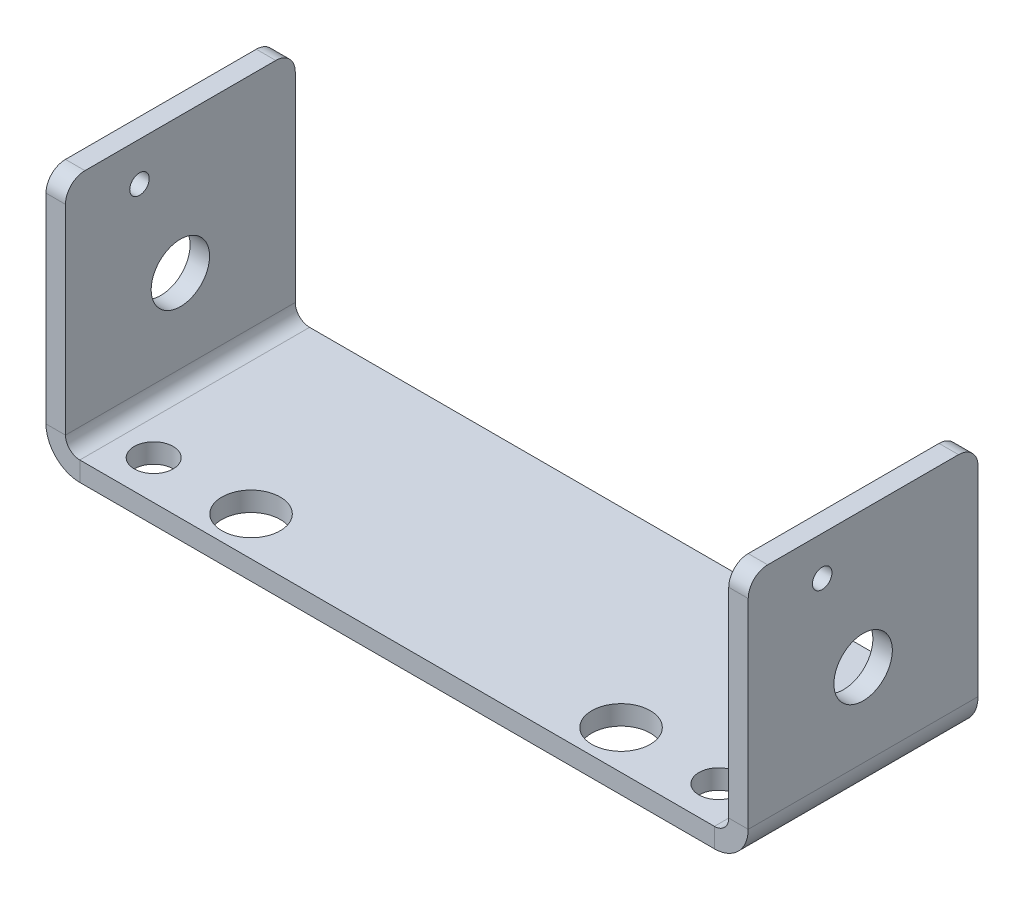
ISO-10303-21;
HEADER;
FILE_DESCRIPTION(('STEP AP214'),'2;1');
FILE_NAME('part.step','',(''),(''),'','','');
FILE_SCHEMA(('AUTOMOTIVE_DESIGN { 1 0 10303 214 1 1 1 1 }'));
ENDSEC;
DATA;
#1=APPLICATION_CONTEXT('core data for automotive mechanical design processes');
#2=APPLICATION_PROTOCOL_DEFINITION('international standard','automotive_design',2000,#1);
#3=PRODUCT_CONTEXT('',#1,'mechanical');
#4=PRODUCT('Part','Part','',(#3));
#5=PRODUCT_RELATED_PRODUCT_CATEGORY('part','',(#4));
#6=PRODUCT_DEFINITION_FORMATION('','',#4);
#7=PRODUCT_DEFINITION_CONTEXT('part definition',#1,'design');
#8=PRODUCT_DEFINITION('design','',#6,#7);
#9=PRODUCT_DEFINITION_SHAPE('','',#8);
#10=(LENGTH_UNIT() NAMED_UNIT(*) SI_UNIT(.MILLI.,.METRE.));
#11=(NAMED_UNIT(*) PLANE_ANGLE_UNIT() SI_UNIT($,.RADIAN.));
#12=(NAMED_UNIT(*) SI_UNIT($,.STERADIAN.) SOLID_ANGLE_UNIT());
#13=UNCERTAINTY_MEASURE_WITH_UNIT(LENGTH_MEASURE(1.E-05),#10,'distance_accuracy_value','');
#14=(GEOMETRIC_REPRESENTATION_CONTEXT(3) GLOBAL_UNCERTAINTY_ASSIGNED_CONTEXT((#13)) GLOBAL_UNIT_ASSIGNED_CONTEXT((#10,
#11,#12)) REPRESENTATION_CONTEXT('',''));
#15=CARTESIAN_POINT('',(0.,0.,0.));
#16=DIRECTION('',(0.,0.,1.));
#17=DIRECTION('',(1.,0.,0.));
#18=AXIS2_PLACEMENT_3D('',#15,#16,#17);
#19=CARTESIAN_POINT('',(-63.0307532622855,33.5307532622854,5.89999999999999));
#20=DIRECTION('',(0.,0.,1.));
#21=DIRECTION('',(1.,0.,0.));
#22=AXIS2_PLACEMENT_3D('',#19,#20,#21);
#23=PLANE('',#22);
#24=DIRECTION('',(1.,0.,0.));
#25=VECTOR('',#24,1.);
#26=CARTESIAN_POINT('',(-63.0307532622855,33.5307532622854,5.89999999999999));
#27=LINE('',#26,#25);
#28=CARTESIAN_POINT('',(-50.824906524571,33.5307532622854,5.89999999999999));
#29=VERTEX_POINT('',#28);
#30=CARTESIAN_POINT('',(-18.2366000000001,33.5307532622854,5.89999999999999));
#31=VERTEX_POINT('',#30);
#32=EDGE_CURVE('E175',#29,#31,#27,.T.);
#33=ORIENTED_EDGE('',*,*,#32,.T.);
#34=DIRECTION('',(0.,1.,0.));
#35=VECTOR('',#34,1.);
#36=CARTESIAN_POINT('',(-18.2366000000001,33.5307532622854,5.89999999999999));
#37=LINE('',#36,#35);
#38=CARTESIAN_POINT('',(-18.2366000000001,34.5307532622854,5.89999999999999));
#39=VERTEX_POINT('',#38);
#40=EDGE_CURVE('E12',#31,#39,#37,.T.);
#41=ORIENTED_EDGE('',*,*,#40,.T.);
#42=DIRECTION('',(1.,0.,0.));
#43=VECTOR('',#42,1.);
#44=CARTESIAN_POINT('',(-63.0307532622855,34.5307532622854,5.89999999999999));
#45=LINE('',#44,#43);
#46=CARTESIAN_POINT('',(-50.824906524571,34.5307532622854,5.89999999999999));
#47=VERTEX_POINT('',#46);
#48=EDGE_CURVE('E61',#47,#39,#45,.T.);
#49=ORIENTED_EDGE('',*,*,#48,.F.);
#50=DIRECTION('',(0.,-1.,0.));
#51=VECTOR('',#50,1.);
#52=CARTESIAN_POINT('',(-50.824906524571,33.5307532622854,5.89999999999999));
#53=LINE('',#52,#51);
#54=EDGE_CURVE('E351',#47,#29,#53,.T.);
#55=ORIENTED_EDGE('',*,*,#54,.T.);
#56=EDGE_LOOP('',(#33,#41,#49,#55));
#57=FACE_BOUND('',#56,.T.);
#58=ADVANCED_FACE('F45',(#57),#23,.T.);
#59=CARTESIAN_POINT('',(-63.0307532622855,33.5307532622854,-5.90000000000001));
#60=DIRECTION('',(0.,0.,-1.));
#61=DIRECTION('',(-1.,0.,0.));
#62=AXIS2_PLACEMENT_3D('',#59,#60,#61);
#63=PLANE('',#62);
#64=DIRECTION('',(-1.,0.,0.));
#65=VECTOR('',#64,1.);
#66=CARTESIAN_POINT('',(-63.0307532622855,34.5307532622854,-5.90000000000001));
#67=LINE('',#66,#65);
#68=CARTESIAN_POINT('',(-18.2366000000001,34.5307532622854,-5.90000000000001));
#69=VERTEX_POINT('',#68);
#70=CARTESIAN_POINT('',(-50.824906524571,34.5307532622854,-5.90000000000001));
#71=VERTEX_POINT('',#70);
#72=EDGE_CURVE('E68',#69,#71,#67,.T.);
#73=ORIENTED_EDGE('',*,*,#72,.F.);
#74=DIRECTION('',(0.,-1.,0.));
#75=VECTOR('',#74,1.);
#76=CARTESIAN_POINT('',(-18.2366000000001,33.5307532622854,-5.90000000000001));
#77=LINE('',#76,#75);
#78=CARTESIAN_POINT('',(-18.2366000000001,33.5307532622854,-5.90000000000001));
#79=VERTEX_POINT('',#78);
#80=EDGE_CURVE('E156',#69,#79,#77,.T.);
#81=ORIENTED_EDGE('',*,*,#80,.T.);
#82=DIRECTION('',(-1.,0.,0.));
#83=VECTOR('',#82,1.);
#84=CARTESIAN_POINT('',(-63.0307532622855,33.5307532622854,-5.90000000000001));
#85=LINE('',#84,#83);
#86=CARTESIAN_POINT('',(-50.824906524571,33.5307532622854,-5.90000000000001));
#87=VERTEX_POINT('',#86);
#88=EDGE_CURVE('E48',#79,#87,#85,.T.);
#89=ORIENTED_EDGE('',*,*,#88,.T.);
#90=DIRECTION('',(0.,1.,0.));
#91=VECTOR('',#90,1.);
#92=CARTESIAN_POINT('',(-50.824906524571,33.5307532622854,-5.90000000000001));
#93=LINE('',#92,#91);
#94=EDGE_CURVE('E184',#87,#71,#93,.T.);
#95=ORIENTED_EDGE('',*,*,#94,.T.);
#96=EDGE_LOOP('',(#73,#81,#89,#95));
#97=FACE_BOUND('',#96,.T.);
#98=ADVANCED_FACE('F158',(#97),#63,.T.);
#99=CARTESIAN_POINT('',(-6.03075326228553,34.5307532622854,4.89999999999999));
#100=DIRECTION('',(0.,1.,0.));
#101=DIRECTION('',(0.,0.,1.));
#102=AXIS2_PLACEMENT_3D('',#99,#100,#101);
#103=PLANE('',#102);
#104=CARTESIAN_POINT('',(-49.0307532622855,34.5307532622854,3.89999999999999));
#105=DIRECTION('',(0.,1.,0.));
#106=DIRECTION('',(0.,0.,1.));
#107=AXIS2_PLACEMENT_3D('',#104,#105,#106);
#108=CIRCLE('',#107,1.);
#109=CARTESIAN_POINT('',(-49.0307532622855,34.5307532622854,4.89999999999999));
#110=VERTEX_POINT('',#109);
#111=EDGE_CURVE('E271',#110,#110,#108,.T.);
#112=ORIENTED_EDGE('',*,*,#111,.F.);
#113=EDGE_LOOP('',(#112));
#114=FACE_BOUND('',#113,.T.);
#115=CARTESIAN_POINT('',(-44.0307532622855,34.5307532622854,3.89999999999999));
#116=DIRECTION('',(0.,1.,0.));
#117=DIRECTION('',(0.,0.,1.));
#118=AXIS2_PLACEMENT_3D('',#115,#116,#117);
#119=CIRCLE('',#118,1.5);
#120=CARTESIAN_POINT('',(-44.0307532622855,34.5307532622854,5.39999999999999));
#121=VERTEX_POINT('',#120);
#122=EDGE_CURVE('E330',#121,#121,#119,.T.);
#123=ORIENTED_EDGE('',*,*,#122,.F.);
#124=EDGE_LOOP('',(#123));
#125=FACE_BOUND('',#124,.T.);
#126=CARTESIAN_POINT('',(-20.0307532622855,34.5307532622854,3.89999999999999));
#127=DIRECTION('',(0.,1.,0.));
#128=DIRECTION('',(0.,0.,1.));
#129=AXIS2_PLACEMENT_3D('',#126,#127,#128);
#130=CIRCLE('',#129,1.);
#131=CARTESIAN_POINT('',(-20.0307532622855,34.5307532622854,4.89999999999999));
#132=VERTEX_POINT('',#131);
#133=EDGE_CURVE('E336',#132,#132,#130,.T.);
#134=ORIENTED_EDGE('',*,*,#133,.F.);
#135=EDGE_LOOP('',(#134));
#136=FACE_BOUND('',#135,.T.);
#137=CARTESIAN_POINT('',(-25.0307532622855,34.5307532622854,3.89999999999999));
#138=DIRECTION('',(0.,1.,0.));
#139=DIRECTION('',(0.,0.,1.));
#140=AXIS2_PLACEMENT_3D('',#137,#138,#139);
#141=CIRCLE('',#140,1.5);
#142=CARTESIAN_POINT('',(-25.0307532622855,34.5307532622854,5.39999999999999));
#143=VERTEX_POINT('',#142);
#144=EDGE_CURVE('E342',#143,#143,#141,.T.);
#145=ORIENTED_EDGE('',*,*,#144,.F.);
#146=EDGE_LOOP('',(#145));
#147=FACE_BOUND('',#146,.T.);
#148=ORIENTED_EDGE('',*,*,#48,.T.);
#149=DIRECTION('',(0.,0.,-1.));
#150=VECTOR('',#149,1.);
#151=CARTESIAN_POINT('',(-18.2366000000001,34.5307532622854,4.89999999999999));
#152=LINE('',#151,#150);
#153=EDGE_CURVE('E53',#39,#69,#152,.T.);
#154=ORIENTED_EDGE('',*,*,#153,.T.);
#155=ORIENTED_EDGE('',*,*,#72,.T.);
#156=DIRECTION('',(0.,0.,1.));
#157=VECTOR('',#156,1.);
#158=CARTESIAN_POINT('',(-50.824906524571,34.5307532622854,4.89999999999998));
#159=LINE('',#158,#157);
#160=EDGE_CURVE('E353',#71,#47,#159,.T.);
#161=ORIENTED_EDGE('',*,*,#160,.T.);
#162=EDGE_LOOP('',(#148,#154,#155,#161));
#163=FACE_BOUND('',#162,.T.);
#164=ADVANCED_FACE('F358',(#114,#125,#136,#147,#163),#103,.T.);
#165=CARTESIAN_POINT('',(-6.03075326228554,33.5307532622854,4.89999999999999));
#166=DIRECTION('',(0.,1.,0.));
#167=DIRECTION('',(0.,0.,1.));
#168=AXIS2_PLACEMENT_3D('',#165,#166,#167);
#169=PLANE('',#168);
#170=DIRECTION('',(0.,0.,-1.));
#171=VECTOR('',#170,1.);
#172=CARTESIAN_POINT('',(-18.2366000000001,33.5307532622854,4.89999999999999));
#173=LINE('',#172,#171);
#174=EDGE_CURVE('E164',#31,#79,#173,.T.);
#175=ORIENTED_EDGE('',*,*,#174,.F.);
#176=ORIENTED_EDGE('',*,*,#32,.F.);
#177=DIRECTION('',(0.,0.,1.));
#178=VECTOR('',#177,1.);
#179=CARTESIAN_POINT('',(-50.824906524571,33.5307532622854,4.89999999999998));
#180=LINE('',#179,#178);
#181=EDGE_CURVE('E173',#87,#29,#180,.T.);
#182=ORIENTED_EDGE('',*,*,#181,.F.);
#183=ORIENTED_EDGE('',*,*,#88,.F.);
#184=EDGE_LOOP('',(#175,#176,#182,#183));
#185=FACE_BOUND('',#184,.T.);
#186=CARTESIAN_POINT('',(-49.0307532622855,33.5307532622854,3.89999999999999));
#187=DIRECTION('',(0.,1.,0.));
#188=DIRECTION('',(0.,0.,1.));
#189=AXIS2_PLACEMENT_3D('',#186,#187,#188);
#190=CIRCLE('',#189,1.);
#191=CARTESIAN_POINT('',(-49.0307532622855,33.5307532622854,4.89999999999999));
#192=VERTEX_POINT('',#191);
#193=EDGE_CURVE('E327',#192,#192,#190,.T.);
#194=ORIENTED_EDGE('',*,*,#193,.T.);
#195=EDGE_LOOP('',(#194));
#196=FACE_BOUND('',#195,.T.);
#197=CARTESIAN_POINT('',(-44.0307532622855,33.5307532622854,3.89999999999999));
#198=DIRECTION('',(0.,1.,0.));
#199=DIRECTION('',(0.,0.,1.));
#200=AXIS2_PLACEMENT_3D('',#197,#198,#199);
#201=CIRCLE('',#200,1.5);
#202=CARTESIAN_POINT('',(-44.0307532622855,33.5307532622854,5.39999999999999));
#203=VERTEX_POINT('',#202);
#204=EDGE_CURVE('E333',#203,#203,#201,.T.);
#205=ORIENTED_EDGE('',*,*,#204,.T.);
#206=EDGE_LOOP('',(#205));
#207=FACE_BOUND('',#206,.T.);
#208=CARTESIAN_POINT('',(-20.0307532622855,33.5307532622854,3.89999999999999));
#209=DIRECTION('',(0.,1.,0.));
#210=DIRECTION('',(0.,0.,1.));
#211=AXIS2_PLACEMENT_3D('',#208,#209,#210);
#212=CIRCLE('',#211,1.);
#213=CARTESIAN_POINT('',(-20.0307532622855,33.5307532622854,4.89999999999999));
#214=VERTEX_POINT('',#213);
#215=EDGE_CURVE('E339',#214,#214,#212,.T.);
#216=ORIENTED_EDGE('',*,*,#215,.T.);
#217=EDGE_LOOP('',(#216));
#218=FACE_BOUND('',#217,.T.);
#219=CARTESIAN_POINT('',(-25.0307532622855,33.5307532622854,3.89999999999999));
#220=DIRECTION('',(0.,1.,0.));
#221=DIRECTION('',(0.,0.,1.));
#222=AXIS2_PLACEMENT_3D('',#219,#220,#221);
#223=CIRCLE('',#222,1.5);
#224=CARTESIAN_POINT('',(-25.0307532622855,33.5307532622854,5.39999999999999));
#225=VERTEX_POINT('',#224);
#226=EDGE_CURVE('E345',#225,#225,#223,.T.);
#227=ORIENTED_EDGE('',*,*,#226,.T.);
#228=EDGE_LOOP('',(#227));
#229=FACE_BOUND('',#228,.T.);
#230=ADVANCED_FACE('F168',(#185,#196,#207,#218,#229),#169,.F.);
#231=CARTESIAN_POINT('',(-25.0307532622855,33.5307532622854,3.89999999999999));
#232=DIRECTION('',(0.,1.,0.));
#233=DIRECTION('',(0.,0.,1.));
#234=AXIS2_PLACEMENT_3D('',#231,#232,#233);
#235=CYLINDRICAL_SURFACE('',#234,1.5);
#236=ORIENTED_EDGE('',*,*,#226,.F.);
#237=EDGE_LOOP('',(#236));
#238=FACE_BOUND('',#237,.T.);
#239=ORIENTED_EDGE('',*,*,#144,.T.);
#240=EDGE_LOOP('',(#239));
#241=FACE_BOUND('',#240,.T.);
#242=ADVANCED_FACE('F427',(#238,#241),#235,.F.);
#243=CARTESIAN_POINT('',(-20.0307532622855,33.5307532622854,3.89999999999999));
#244=DIRECTION('',(0.,1.,0.));
#245=DIRECTION('',(0.,0.,1.));
#246=AXIS2_PLACEMENT_3D('',#243,#244,#245);
#247=CYLINDRICAL_SURFACE('',#246,1.);
#248=ORIENTED_EDGE('',*,*,#215,.F.);
#249=EDGE_LOOP('',(#248));
#250=FACE_BOUND('',#249,.T.);
#251=ORIENTED_EDGE('',*,*,#133,.T.);
#252=EDGE_LOOP('',(#251));
#253=FACE_BOUND('',#252,.T.);
#254=ADVANCED_FACE('F430',(#250,#253),#247,.F.);
#255=CARTESIAN_POINT('',(-44.0307532622855,33.5307532622854,3.89999999999999));
#256=DIRECTION('',(0.,1.,0.));
#257=DIRECTION('',(0.,0.,1.));
#258=AXIS2_PLACEMENT_3D('',#255,#256,#257);
#259=CYLINDRICAL_SURFACE('',#258,1.5);
#260=ORIENTED_EDGE('',*,*,#204,.F.);
#261=EDGE_LOOP('',(#260));
#262=FACE_BOUND('',#261,.T.);
#263=ORIENTED_EDGE('',*,*,#122,.T.);
#264=EDGE_LOOP('',(#263));
#265=FACE_BOUND('',#264,.T.);
#266=ADVANCED_FACE('F434',(#262,#265),#259,.F.);
#267=CARTESIAN_POINT('',(-49.0307532622855,33.5307532622854,3.89999999999999));
#268=DIRECTION('',(0.,1.,0.));
#269=DIRECTION('',(0.,0.,1.));
#270=AXIS2_PLACEMENT_3D('',#267,#268,#269);
#271=CYLINDRICAL_SURFACE('',#270,1.);
#272=ORIENTED_EDGE('',*,*,#193,.F.);
#273=EDGE_LOOP('',(#272));
#274=FACE_BOUND('',#273,.T.);
#275=ORIENTED_EDGE('',*,*,#111,.T.);
#276=EDGE_LOOP('',(#275));
#277=FACE_BOUND('',#276,.T.);
#278=ADVANCED_FACE('F438',(#274,#277),#271,.F.);
#279=CARTESIAN_POINT('',(-52.5615065245709,45.5307532622854,-4.90000000000001));
#280=DIRECTION('',(1.,0.,0.));
#281=DIRECTION('',(0.,0.,1.));
#282=AXIS2_PLACEMENT_3D('',#279,#280,#281);
#283=CYLINDRICAL_SURFACE('',#282,1.);
#284=CARTESIAN_POINT('',(-51.5615065245709,45.5307532622854,-4.90000000000001));
#285=DIRECTION('',(1.,0.,0.));
#286=DIRECTION('',(0.,0.,1.));
#287=AXIS2_PLACEMENT_3D('',#284,#285,#286);
#288=CIRCLE('',#287,1.);
#289=CARTESIAN_POINT('',(-51.5615065245709,45.5307532622854,-5.90000000000001));
#290=VERTEX_POINT('',#289);
#291=CARTESIAN_POINT('',(-51.5615065245709,46.5307532622854,-4.9));
#292=VERTEX_POINT('',#291);
#293=EDGE_CURVE('E282',#290,#292,#288,.T.);
#294=ORIENTED_EDGE('',*,*,#293,.F.);
#295=DIRECTION('',(1.,0.,0.));
#296=VECTOR('',#295,1.);
#297=CARTESIAN_POINT('',(-52.5615065245709,45.5307532622854,-5.90000000000001));
#298=LINE('',#297,#296);
#299=CARTESIAN_POINT('',(-52.5615065245709,45.5307532622854,-5.90000000000001));
#300=VERTEX_POINT('',#299);
#301=EDGE_CURVE('E268',#300,#290,#298,.T.);
#302=ORIENTED_EDGE('',*,*,#301,.F.);
#303=CARTESIAN_POINT('',(-52.5615065245709,45.5307532622854,-4.90000000000001));
#304=DIRECTION('',(1.,0.,0.));
#305=DIRECTION('',(0.,0.,1.));
#306=AXIS2_PLACEMENT_3D('',#303,#304,#305);
#307=CIRCLE('',#306,1.);
#308=CARTESIAN_POINT('',(-52.5615065245709,46.5307532622854,-4.9));
#309=VERTEX_POINT('',#308);
#310=EDGE_CURVE('E316',#300,#309,#307,.T.);
#311=ORIENTED_EDGE('',*,*,#310,.T.);
#312=DIRECTION('',(1.,0.,0.));
#313=VECTOR('',#312,1.);
#314=CARTESIAN_POINT('',(-52.5615065245709,46.5307532622854,-4.9));
#315=LINE('',#314,#313);
#316=EDGE_CURVE('E314',#309,#292,#315,.T.);
#317=ORIENTED_EDGE('',*,*,#316,.T.);
#318=EDGE_LOOP('',(#294,#302,#311,#317));
#319=FACE_BOUND('',#318,.T.);
#320=ADVANCED_FACE('F398',(#319),#283,.T.);
#321=CARTESIAN_POINT('',(-52.5615065245709,46.5307532622854,-4.9));
#322=DIRECTION('',(0.,1.,0.));
#323=DIRECTION('',(0.,0.,1.));
#324=AXIS2_PLACEMENT_3D('',#321,#322,#323);
#325=PLANE('',#324);
#326=DIRECTION('',(0.,0.,1.));
#327=VECTOR('',#326,1.);
#328=CARTESIAN_POINT('',(-51.5615065245709,46.5307532622854,-4.9));
#329=LINE('',#328,#327);
#330=CARTESIAN_POINT('',(-51.5615065245709,46.5307532622854,4.89999999999999));
#331=VERTEX_POINT('',#330);
#332=EDGE_CURVE('E279',#292,#331,#329,.T.);
#333=ORIENTED_EDGE('',*,*,#332,.F.);
#334=ORIENTED_EDGE('',*,*,#316,.F.);
#335=DIRECTION('',(0.,0.,1.));
#336=VECTOR('',#335,1.);
#337=CARTESIAN_POINT('',(-52.5615065245709,46.5307532622854,-4.9));
#338=LINE('',#337,#336);
#339=CARTESIAN_POINT('',(-52.5615065245709,46.5307532622854,4.89999999999999));
#340=VERTEX_POINT('',#339);
#341=EDGE_CURVE('E311',#309,#340,#338,.T.);
#342=ORIENTED_EDGE('',*,*,#341,.T.);
#343=DIRECTION('',(1.,0.,0.));
#344=VECTOR('',#343,1.);
#345=CARTESIAN_POINT('',(-52.5615065245709,46.5307532622854,4.89999999999999));
#346=LINE('',#345,#344);
#347=EDGE_CURVE('E309',#340,#331,#346,.T.);
#348=ORIENTED_EDGE('',*,*,#347,.T.);
#349=EDGE_LOOP('',(#333,#334,#342,#348));
#350=FACE_BOUND('',#349,.T.);
#351=ADVANCED_FACE('F401',(#350),#325,.T.);
#352=CARTESIAN_POINT('',(-52.5615065245709,45.5307532622854,4.89999999999999));
#353=DIRECTION('',(1.,0.,0.));
#354=DIRECTION('',(0.,0.,1.));
#355=AXIS2_PLACEMENT_3D('',#352,#353,#354);
#356=CYLINDRICAL_SURFACE('',#355,1.);
#357=CARTESIAN_POINT('',(-51.5615065245709,45.5307532622854,4.89999999999999));
#358=DIRECTION('',(1.,0.,0.));
#359=DIRECTION('',(0.,0.,1.));
#360=AXIS2_PLACEMENT_3D('',#357,#358,#359);
#361=CIRCLE('',#360,1.);
#362=CARTESIAN_POINT('',(-51.5615065245709,45.5307532622854,5.89999999999999));
#363=VERTEX_POINT('',#362);
#364=EDGE_CURVE('E276',#331,#363,#361,.T.);
#365=ORIENTED_EDGE('',*,*,#364,.F.);
#366=ORIENTED_EDGE('',*,*,#347,.F.);
#367=CARTESIAN_POINT('',(-52.5615065245709,45.5307532622854,4.89999999999999));
#368=DIRECTION('',(1.,0.,0.));
#369=DIRECTION('',(0.,0.,1.));
#370=AXIS2_PLACEMENT_3D('',#367,#368,#369);
#371=CIRCLE('',#370,1.);
#372=CARTESIAN_POINT('',(-52.5615065245709,45.5307532622854,5.89999999999999));
#373=VERTEX_POINT('',#372);
#374=EDGE_CURVE('E306',#340,#373,#371,.T.);
#375=ORIENTED_EDGE('',*,*,#374,.T.);
#376=DIRECTION('',(1.,0.,0.));
#377=VECTOR('',#376,1.);
#378=CARTESIAN_POINT('',(-52.5615065245709,45.5307532622854,5.89999999999999));
#379=LINE('',#378,#377);
#380=EDGE_CURVE('E304',#373,#363,#379,.T.);
#381=ORIENTED_EDGE('',*,*,#380,.T.);
#382=EDGE_LOOP('',(#365,#366,#375,#381));
#383=FACE_BOUND('',#382,.T.);
#384=ADVANCED_FACE('F403',(#383),#356,.T.);
#385=CARTESIAN_POINT('',(-52.5615065245709,44.5307532622854,2.09999999999999));
#386=DIRECTION('',(1.,0.,0.));
#387=DIRECTION('',(0.,0.,1.));
#388=AXIS2_PLACEMENT_3D('',#385,#386,#387);
#389=CYLINDRICAL_SURFACE('',#388,0.499999999999999);
#390=CARTESIAN_POINT('',(-52.5615065245709,44.5307532622854,2.09999999999999));
#391=DIRECTION('',(1.,0.,0.));
#392=DIRECTION('',(0.,0.,1.));
#393=AXIS2_PLACEMENT_3D('',#390,#391,#392);
#394=CIRCLE('',#393,0.499999999999999);
#395=CARTESIAN_POINT('',(-52.5615065245709,44.5307532622854,2.59999999999999));
#396=VERTEX_POINT('',#395);
#397=EDGE_CURVE('E292',#396,#396,#394,.T.);
#398=ORIENTED_EDGE('',*,*,#397,.F.);
#399=EDGE_LOOP('',(#398));
#400=FACE_BOUND('',#399,.T.);
#401=CARTESIAN_POINT('',(-51.5615065245709,44.5307532622854,2.09999999999999));
#402=DIRECTION('',(1.,0.,0.));
#403=DIRECTION('',(0.,0.,1.));
#404=AXIS2_PLACEMENT_3D('',#401,#402,#403);
#405=CIRCLE('',#404,0.499999999999999);
#406=CARTESIAN_POINT('',(-51.5615065245709,44.5307532622854,2.59999999999999));
#407=VERTEX_POINT('',#406);
#408=EDGE_CURVE('E301',#407,#407,#405,.T.);
#409=ORIENTED_EDGE('',*,*,#408,.T.);
#410=EDGE_LOOP('',(#409));
#411=FACE_BOUND('',#410,.T.);
#412=ADVANCED_FACE('F405',(#400,#411),#389,.F.);
#413=CARTESIAN_POINT('',(-52.561506524571,39.5307532622854,0.));
#414=DIRECTION('',(1.,0.,0.));
#415=DIRECTION('',(0.,0.,1.));
#416=AXIS2_PLACEMENT_3D('',#413,#414,#415);
#417=CYLINDRICAL_SURFACE('',#416,1.5);
#418=CARTESIAN_POINT('',(-52.561506524571,39.5307532622854,0.));
#419=DIRECTION('',(1.,0.,0.));
#420=DIRECTION('',(0.,0.,1.));
#421=AXIS2_PLACEMENT_3D('',#418,#419,#420);
#422=CIRCLE('',#421,1.5);
#423=CARTESIAN_POINT('',(-52.561506524571,39.5307532622854,1.49999999999999));
#424=VERTEX_POINT('',#423);
#425=EDGE_CURVE('E295',#424,#424,#422,.T.);
#426=ORIENTED_EDGE('',*,*,#425,.F.);
#427=EDGE_LOOP('',(#426));
#428=FACE_BOUND('',#427,.T.);
#429=CARTESIAN_POINT('',(-51.561506524571,39.5307532622854,0.));
#430=DIRECTION('',(1.,0.,0.));
#431=DIRECTION('',(0.,0.,1.));
#432=AXIS2_PLACEMENT_3D('',#429,#430,#431);
#433=CIRCLE('',#432,1.5);
#434=CARTESIAN_POINT('',(-51.561506524571,39.5307532622854,1.49999999999999));
#435=VERTEX_POINT('',#434);
#436=EDGE_CURVE('E298',#435,#435,#433,.T.);
#437=ORIENTED_EDGE('',*,*,#436,.T.);
#438=EDGE_LOOP('',(#437));
#439=FACE_BOUND('',#438,.T.);
#440=ADVANCED_FACE('F411',(#428,#439),#417,.F.);
#441=CARTESIAN_POINT('',(-52.5615065245711,-11.4692467377146,4.89999999999998));
#442=DIRECTION('',(1.,0.,0.));
#443=DIRECTION('',(0.,0.,1.));
#444=AXIS2_PLACEMENT_3D('',#441,#442,#443);
#445=PLANE('',#444);
#446=ORIENTED_EDGE('',*,*,#425,.T.);
#447=EDGE_LOOP('',(#446));
#448=FACE_BOUND('',#447,.T.);
#449=ORIENTED_EDGE('',*,*,#397,.T.);
#450=EDGE_LOOP('',(#449));
#451=FACE_BOUND('',#450,.T.);
#452=DIRECTION('',(0.,1.,0.));
#453=VECTOR('',#452,1.);
#454=CARTESIAN_POINT('',(-52.5615065245709,45.5307532622854,-5.90000000000001));
#455=LINE('',#454,#453);
#456=CARTESIAN_POINT('',(-52.561506524571,35.2673532622854,-5.90000000000001));
#457=VERTEX_POINT('',#456);
#458=EDGE_CURVE('E272',#457,#300,#455,.T.);
#459=ORIENTED_EDGE('',*,*,#458,.F.);
#460=DIRECTION('',(0.,0.,1.));
#461=VECTOR('',#460,1.);
#462=CARTESIAN_POINT('',(-52.561506524571,35.2673532622854,4.89999999999998));
#463=LINE('',#462,#461);
#464=CARTESIAN_POINT('',(-52.561506524571,35.2673532622854,5.89999999999999));
#465=VERTEX_POINT('',#464);
#466=EDGE_CURVE('E289',#457,#465,#463,.T.);
#467=ORIENTED_EDGE('',*,*,#466,.T.);
#468=DIRECTION('',(0.,-1.,0.));
#469=VECTOR('',#468,1.);
#470=CARTESIAN_POINT('',(-52.5615065245709,45.5307532622854,5.89999999999999));
#471=LINE('',#470,#469);
#472=EDGE_CURVE('E287',#373,#465,#471,.T.);
#473=ORIENTED_EDGE('',*,*,#472,.F.);
#474=ORIENTED_EDGE('',*,*,#374,.F.);
#475=ORIENTED_EDGE('',*,*,#341,.F.);
#476=ORIENTED_EDGE('',*,*,#310,.F.);
#477=EDGE_LOOP('',(#459,#467,#473,#474,#475,#476));
#478=FACE_BOUND('',#477,.T.);
#479=ADVANCED_FACE('F393',(#448,#451,#478),#445,.F.);
#480=CARTESIAN_POINT('',(-52.5615065245709,45.5307532622854,5.89999999999999));
#481=DIRECTION('',(0.,0.,1.));
#482=DIRECTION('',(0.,-1.,0.));
#483=AXIS2_PLACEMENT_3D('',#480,#481,#482);
#484=PLANE('',#483);
#485=DIRECTION('',(-1.,0.,0.));
#486=VECTOR('',#485,1.);
#487=CARTESIAN_POINT('',(-52.561506524571,35.2673532622854,5.89999999999999));
#488=LINE('',#487,#486);
#489=CARTESIAN_POINT('',(-51.561506524571,35.2673532622854,5.89999999999999));
#490=VERTEX_POINT('',#489);
#491=EDGE_CURVE('E319',#490,#465,#488,.T.);
#492=ORIENTED_EDGE('',*,*,#491,.F.);
#493=DIRECTION('',(0.,-1.,0.));
#494=VECTOR('',#493,1.);
#495=CARTESIAN_POINT('',(-51.5615065245709,45.5307532622854,5.89999999999999));
#496=LINE('',#495,#494);
#497=EDGE_CURVE('E274',#363,#490,#496,.T.);
#498=ORIENTED_EDGE('',*,*,#497,.F.);
#499=ORIENTED_EDGE('',*,*,#380,.F.);
#500=ORIENTED_EDGE('',*,*,#472,.T.);
#501=EDGE_LOOP('',(#492,#498,#499,#500));
#502=FACE_BOUND('',#501,.T.);
#503=ADVANCED_FACE('F383',(#502),#484,.T.);
#504=CARTESIAN_POINT('',(-51.5615065245711,-11.4692467377146,4.89999999999998));
#505=DIRECTION('',(1.,0.,0.));
#506=DIRECTION('',(0.,0.,1.));
#507=AXIS2_PLACEMENT_3D('',#504,#505,#506);
#508=PLANE('',#507);
#509=DIRECTION('',(0.,0.,1.));
#510=VECTOR('',#509,1.);
#511=CARTESIAN_POINT('',(-51.561506524571,35.2673532622854,4.89999999999998));
#512=LINE('',#511,#510);
#513=CARTESIAN_POINT('',(-51.561506524571,35.2673532622854,-5.90000000000001));
#514=VERTEX_POINT('',#513);
#515=EDGE_CURVE('E322',#514,#490,#512,.T.);
#516=ORIENTED_EDGE('',*,*,#515,.F.);
#517=DIRECTION('',(0.,1.,0.));
#518=VECTOR('',#517,1.);
#519=CARTESIAN_POINT('',(-51.5615065245709,45.5307532622854,-5.90000000000001));
#520=LINE('',#519,#518);
#521=EDGE_CURVE('E285',#514,#290,#520,.T.);
#522=ORIENTED_EDGE('',*,*,#521,.T.);
#523=ORIENTED_EDGE('',*,*,#293,.T.);
#524=ORIENTED_EDGE('',*,*,#332,.T.);
#525=ORIENTED_EDGE('',*,*,#364,.T.);
#526=ORIENTED_EDGE('',*,*,#497,.T.);
#527=EDGE_LOOP('',(#516,#522,#523,#524,#525,#526));
#528=FACE_BOUND('',#527,.T.);
#529=ORIENTED_EDGE('',*,*,#408,.F.);
#530=EDGE_LOOP('',(#529));
#531=FACE_BOUND('',#530,.T.);
#532=ORIENTED_EDGE('',*,*,#436,.F.);
#533=EDGE_LOOP('',(#532));
#534=FACE_BOUND('',#533,.T.);
#535=ADVANCED_FACE('F377',(#528,#531,#534),#508,.T.);
#536=CARTESIAN_POINT('',(-52.5615065245709,45.5307532622854,-5.90000000000001));
#537=DIRECTION('',(0.,0.,-1.));
#538=DIRECTION('',(0.,1.,0.));
#539=AXIS2_PLACEMENT_3D('',#536,#537,#538);
#540=PLANE('',#539);
#541=DIRECTION('',(1.,0.,0.));
#542=VECTOR('',#541,1.);
#543=CARTESIAN_POINT('',(-52.561506524571,35.2673532622854,-5.90000000000001));
#544=LINE('',#543,#542);
#545=EDGE_CURVE('E263',#457,#514,#544,.T.);
#546=ORIENTED_EDGE('',*,*,#545,.F.);
#547=ORIENTED_EDGE('',*,*,#458,.T.);
#548=ORIENTED_EDGE('',*,*,#301,.T.);
#549=ORIENTED_EDGE('',*,*,#521,.F.);
#550=EDGE_LOOP('',(#546,#547,#548,#549));
#551=FACE_BOUND('',#550,.T.);
#552=ADVANCED_FACE('F372',(#551),#540,.T.);
#553=CARTESIAN_POINT('',(-50.824906524571,35.2673532622854,-5.90000000000001));
#554=DIRECTION('',(0.,0.,-1.));
#555=DIRECTION('',(0.,1.,0.));
#556=AXIS2_PLACEMENT_3D('',#553,#554,#555);
#557=PLANE('',#556);
#558=ORIENTED_EDGE('',*,*,#545,.T.);
#559=CARTESIAN_POINT('',(-50.824906524571,35.2673532622854,-5.90000000000001));
#560=DIRECTION('',(0.,0.,1.));
#561=DIRECTION('',(0.,-1.,0.));
#562=AXIS2_PLACEMENT_3D('',#559,#560,#561);
#563=CIRCLE('',#562,0.7366);
#564=EDGE_CURVE('E205',#514,#71,#563,.T.);
#565=ORIENTED_EDGE('',*,*,#564,.T.);
#566=ORIENTED_EDGE('',*,*,#94,.F.);
#567=CARTESIAN_POINT('',(-50.824906524571,35.2673532622854,-5.90000000000001));
#568=DIRECTION('',(0.,0.,1.));
#569=DIRECTION('',(0.,1.,0.));
#570=AXIS2_PLACEMENT_3D('',#567,#568,#569);
#571=CIRCLE('',#570,1.7366);
#572=EDGE_CURVE('E256',#457,#87,#571,.T.);
#573=ORIENTED_EDGE('',*,*,#572,.F.);
#574=EDGE_LOOP('',(#558,#565,#566,#573));
#575=FACE_BOUND('',#574,.T.);
#576=ADVANCED_FACE('F368',(#575),#557,.T.);
#577=CARTESIAN_POINT('',(-50.824906524571,35.2673532622854,5.89999999999999));
#578=DIRECTION('',(0.,0.,1.));
#579=DIRECTION('',(0.,-1.,0.));
#580=AXIS2_PLACEMENT_3D('',#577,#578,#579);
#581=PLANE('',#580);
#582=ORIENTED_EDGE('',*,*,#54,.F.);
#583=CARTESIAN_POINT('',(-50.824906524571,35.2673532622854,5.9));
#584=DIRECTION('',(0.,0.,1.));
#585=DIRECTION('',(0.,-1.,0.));
#586=AXIS2_PLACEMENT_3D('',#583,#584,#585);
#587=CIRCLE('',#586,0.7366);
#588=EDGE_CURVE('E260',#47,#490,#587,.F.);
#589=ORIENTED_EDGE('',*,*,#588,.T.);
#590=ORIENTED_EDGE('',*,*,#491,.T.);
#591=CARTESIAN_POINT('',(-50.824906524571,35.2673532622854,5.89999999999999));
#592=DIRECTION('',(0.,0.,-1.));
#593=DIRECTION('',(0.,-1.,0.));
#594=AXIS2_PLACEMENT_3D('',#591,#592,#593);
#595=CIRCLE('',#594,1.7366);
#596=EDGE_CURVE('E259',#29,#465,#595,.T.);
#597=ORIENTED_EDGE('',*,*,#596,.F.);
#598=EDGE_LOOP('',(#582,#589,#590,#597));
#599=FACE_BOUND('',#598,.T.);
#600=ADVANCED_FACE('F387',(#599),#581,.T.);
#601=CARTESIAN_POINT('',(-50.824906524571,35.2673532622854,-12.000545792957));
#602=DIRECTION('',(0.,0.,1.));
#603=DIRECTION('',(0.,-1.,0.));
#604=AXIS2_PLACEMENT_3D('',#601,#602,#603);
#605=CYLINDRICAL_SURFACE('',#604,1.7366);
#606=ORIENTED_EDGE('',*,*,#596,.T.);
#607=ORIENTED_EDGE('',*,*,#466,.F.);
#608=ORIENTED_EDGE('',*,*,#572,.T.);
#609=ORIENTED_EDGE('',*,*,#181,.T.);
#610=EDGE_LOOP('',(#606,#607,#608,#609));
#611=FACE_BOUND('',#610,.T.);
#612=ADVANCED_FACE('F391',(#611),#605,.T.);
#613=CARTESIAN_POINT('',(-50.824906524571,35.2673532622854,-12.000545792957));
#614=DIRECTION('',(0.,0.,1.));
#615=DIRECTION('',(0.,-1.,0.));
#616=AXIS2_PLACEMENT_3D('',#613,#614,#615);
#617=CYLINDRICAL_SURFACE('',#616,0.7366);
#618=ORIENTED_EDGE('',*,*,#588,.F.);
#619=ORIENTED_EDGE('',*,*,#160,.F.);
#620=ORIENTED_EDGE('',*,*,#564,.F.);
#621=ORIENTED_EDGE('',*,*,#515,.T.);
#622=EDGE_LOOP('',(#618,#619,#620,#621));
#623=FACE_BOUND('',#622,.T.);
#624=ADVANCED_FACE('F367',(#623),#617,.F.);
#625=CARTESIAN_POINT('',(-16.5000000000002,45.5307532622854,4.89999999999999));
#626=DIRECTION('',(-1.,0.,0.));
#627=DIRECTION('',(0.,0.,1.));
#628=AXIS2_PLACEMENT_3D('',#625,#626,#627);
#629=CYLINDRICAL_SURFACE('',#628,1.);
#630=CARTESIAN_POINT('',(-17.5000000000002,45.5307532622854,4.89999999999999));
#631=DIRECTION('',(-1.,0.,0.));
#632=DIRECTION('',(0.,0.,1.));
#633=AXIS2_PLACEMENT_3D('',#630,#631,#632);
#634=CIRCLE('',#633,1.);
#635=CARTESIAN_POINT('',(-17.5000000000002,45.5307532622854,5.89999999999999));
#636=VERTEX_POINT('',#635);
#637=CARTESIAN_POINT('',(-17.5000000000002,46.5307532622854,4.89999999999998));
#638=VERTEX_POINT('',#637);
#639=EDGE_CURVE('E216',#636,#638,#634,.T.);
#640=ORIENTED_EDGE('',*,*,#639,.F.);
#641=DIRECTION('',(-1.,0.,0.));
#642=VECTOR('',#641,1.);
#643=CARTESIAN_POINT('',(-16.5000000000002,45.5307532622854,5.89999999999999));
#644=LINE('',#643,#642);
#645=CARTESIAN_POINT('',(-16.5000000000002,45.5307532622854,5.89999999999999));
#646=VERTEX_POINT('',#645);
#647=EDGE_CURVE('E202',#646,#636,#644,.T.);
#648=ORIENTED_EDGE('',*,*,#647,.F.);
#649=CARTESIAN_POINT('',(-16.5000000000002,45.5307532622854,4.89999999999999));
#650=DIRECTION('',(-1.,0.,0.));
#651=DIRECTION('',(0.,0.,1.));
#652=AXIS2_PLACEMENT_3D('',#649,#650,#651);
#653=CIRCLE('',#652,1.);
#654=CARTESIAN_POINT('',(-16.5000000000002,46.5307532622854,4.89999999999998));
#655=VERTEX_POINT('',#654);
#656=EDGE_CURVE('E250',#646,#655,#653,.T.);
#657=ORIENTED_EDGE('',*,*,#656,.T.);
#658=DIRECTION('',(-1.,0.,0.));
#659=VECTOR('',#658,1.);
#660=CARTESIAN_POINT('',(-16.5000000000002,46.5307532622854,4.89999999999998));
#661=LINE('',#660,#659);
#662=EDGE_CURVE('E248',#655,#638,#661,.T.);
#663=ORIENTED_EDGE('',*,*,#662,.T.);
#664=EDGE_LOOP('',(#640,#648,#657,#663));
#665=FACE_BOUND('',#664,.T.);
#666=ADVANCED_FACE('F506',(#665),#629,.T.);
#667=CARTESIAN_POINT('',(-16.5000000000002,46.5307532622854,-4.90000000000001));
#668=DIRECTION('',(0.,1.,0.));
#669=DIRECTION('',(0.,0.,-1.));
#670=AXIS2_PLACEMENT_3D('',#667,#668,#669);
#671=PLANE('',#670);
#672=DIRECTION('',(0.,0.,-1.));
#673=VECTOR('',#672,1.);
#674=CARTESIAN_POINT('',(-17.5000000000002,46.5307532622854,-4.90000000000001));
#675=LINE('',#674,#673);
#676=CARTESIAN_POINT('',(-17.5000000000002,46.5307532622854,-4.90000000000001));
#677=VERTEX_POINT('',#676);
#678=EDGE_CURVE('E213',#638,#677,#675,.T.);
#679=ORIENTED_EDGE('',*,*,#678,.F.);
#680=ORIENTED_EDGE('',*,*,#662,.F.);
#681=DIRECTION('',(0.,0.,-1.));
#682=VECTOR('',#681,1.);
#683=CARTESIAN_POINT('',(-16.5000000000002,46.5307532622854,-4.90000000000001));
#684=LINE('',#683,#682);
#685=CARTESIAN_POINT('',(-16.5000000000002,46.5307532622854,-4.90000000000001));
#686=VERTEX_POINT('',#685);
#687=EDGE_CURVE('E245',#655,#686,#684,.T.);
#688=ORIENTED_EDGE('',*,*,#687,.T.);
#689=DIRECTION('',(-1.,0.,0.));
#690=VECTOR('',#689,1.);
#691=CARTESIAN_POINT('',(-16.5000000000002,46.5307532622854,-4.90000000000001));
#692=LINE('',#691,#690);
#693=EDGE_CURVE('E243',#686,#677,#692,.T.);
#694=ORIENTED_EDGE('',*,*,#693,.T.);
#695=EDGE_LOOP('',(#679,#680,#688,#694));
#696=FACE_BOUND('',#695,.T.);
#697=ADVANCED_FACE('F513',(#696),#671,.T.);
#698=CARTESIAN_POINT('',(-16.5000000000002,45.5307532622854,-4.90000000000001));
#699=DIRECTION('',(-1.,0.,0.));
#700=DIRECTION('',(0.,0.,1.));
#701=AXIS2_PLACEMENT_3D('',#698,#699,#700);
#702=CYLINDRICAL_SURFACE('',#701,1.);
#703=CARTESIAN_POINT('',(-17.5000000000002,45.5307532622854,-4.90000000000001));
#704=DIRECTION('',(-1.,0.,0.));
#705=DIRECTION('',(0.,0.,-1.));
#706=AXIS2_PLACEMENT_3D('',#703,#704,#705);
#707=CIRCLE('',#706,1.);
#708=CARTESIAN_POINT('',(-17.5000000000002,45.5307532622854,-5.90000000000001));
#709=VERTEX_POINT('',#708);
#710=EDGE_CURVE('E210',#677,#709,#707,.T.);
#711=ORIENTED_EDGE('',*,*,#710,.F.);
#712=ORIENTED_EDGE('',*,*,#693,.F.);
#713=CARTESIAN_POINT('',(-16.5000000000002,45.5307532622854,-4.90000000000001));
#714=DIRECTION('',(-1.,0.,0.));
#715=DIRECTION('',(0.,0.,-1.));
#716=AXIS2_PLACEMENT_3D('',#713,#714,#715);
#717=CIRCLE('',#716,1.);
#718=CARTESIAN_POINT('',(-16.5000000000002,45.5307532622854,-5.90000000000001));
#719=VERTEX_POINT('',#718);
#720=EDGE_CURVE('E240',#686,#719,#717,.T.);
#721=ORIENTED_EDGE('',*,*,#720,.T.);
#722=DIRECTION('',(-1.,0.,0.));
#723=VECTOR('',#722,1.);
#724=CARTESIAN_POINT('',(-16.5000000000002,45.5307532622854,-5.90000000000001));
#725=LINE('',#724,#723);
#726=EDGE_CURVE('E238',#719,#709,#725,.T.);
#727=ORIENTED_EDGE('',*,*,#726,.T.);
#728=EDGE_LOOP('',(#711,#712,#721,#727));
#729=FACE_BOUND('',#728,.T.);
#730=ADVANCED_FACE('F521',(#729),#702,.T.);
#731=CARTESIAN_POINT('',(-16.5000000000002,44.5307532622854,2.09999999999999));
#732=DIRECTION('',(-1.,0.,0.));
#733=DIRECTION('',(0.,0.,1.));
#734=AXIS2_PLACEMENT_3D('',#731,#732,#733);
#735=CYLINDRICAL_SURFACE('',#734,0.499999999999999);
#736=CARTESIAN_POINT('',(-16.5000000000002,44.5307532622854,2.09999999999999));
#737=DIRECTION('',(-1.,0.,0.));
#738=DIRECTION('',(0.,0.,1.));
#739=AXIS2_PLACEMENT_3D('',#736,#737,#738);
#740=CIRCLE('',#739,0.499999999999999);
#741=CARTESIAN_POINT('',(-16.5000000000002,44.5307532622854,2.59999999999998));
#742=VERTEX_POINT('',#741);
#743=EDGE_CURVE('E226',#742,#742,#740,.T.);
#744=ORIENTED_EDGE('',*,*,#743,.F.);
#745=EDGE_LOOP('',(#744));
#746=FACE_BOUND('',#745,.T.);
#747=CARTESIAN_POINT('',(-17.5000000000002,44.5307532622854,2.09999999999998));
#748=DIRECTION('',(-1.,0.,0.));
#749=DIRECTION('',(0.,0.,1.));
#750=AXIS2_PLACEMENT_3D('',#747,#748,#749);
#751=CIRCLE('',#750,0.499999999999999);
#752=CARTESIAN_POINT('',(-17.5000000000002,44.5307532622854,2.59999999999998));
#753=VERTEX_POINT('',#752);
#754=EDGE_CURVE('E235',#753,#753,#751,.T.);
#755=ORIENTED_EDGE('',*,*,#754,.T.);
#756=EDGE_LOOP('',(#755));
#757=FACE_BOUND('',#756,.T.);
#758=ADVANCED_FACE('F529',(#746,#757),#735,.F.);
#759=CARTESIAN_POINT('',(-16.5000000000002,39.5307532622854,0.));
#760=DIRECTION('',(-1.,0.,0.));
#761=DIRECTION('',(0.,0.,1.));
#762=AXIS2_PLACEMENT_3D('',#759,#760,#761);
#763=CYLINDRICAL_SURFACE('',#762,1.5);
#764=CARTESIAN_POINT('',(-16.5000000000002,39.5307532622854,0.));
#765=DIRECTION('',(-1.,0.,0.));
#766=DIRECTION('',(0.,0.,1.));
#767=AXIS2_PLACEMENT_3D('',#764,#765,#766);
#768=CIRCLE('',#767,1.5);
#769=CARTESIAN_POINT('',(-16.5000000000002,39.5307532622854,1.49999999999999));
#770=VERTEX_POINT('',#769);
#771=EDGE_CURVE('E229',#770,#770,#768,.T.);
#772=ORIENTED_EDGE('',*,*,#771,.F.);
#773=EDGE_LOOP('',(#772));
#774=FACE_BOUND('',#773,.T.);
#775=CARTESIAN_POINT('',(-17.5000000000002,39.5307532622854,0.));
#776=DIRECTION('',(-1.,0.,0.));
#777=DIRECTION('',(0.,0.,1.));
#778=AXIS2_PLACEMENT_3D('',#775,#776,#777);
#779=CIRCLE('',#778,1.5);
#780=CARTESIAN_POINT('',(-17.5000000000002,39.5307532622854,1.49999999999999));
#781=VERTEX_POINT('',#780);
#782=EDGE_CURVE('E232',#781,#781,#779,.T.);
#783=ORIENTED_EDGE('',*,*,#782,.T.);
#784=EDGE_LOOP('',(#783));
#785=FACE_BOUND('',#784,.T.);
#786=ADVANCED_FACE('F537',(#774,#785),#763,.F.);
#787=CARTESIAN_POINT('',(-16.5000000000002,45.5307532622854,4.89999999999999));
#788=DIRECTION('',(-1.,0.,0.));
#789=DIRECTION('',(0.,0.,1.));
#790=AXIS2_PLACEMENT_3D('',#787,#788,#789);
#791=PLANE('',#790);
#792=ORIENTED_EDGE('',*,*,#771,.T.);
#793=EDGE_LOOP('',(#792));
#794=FACE_BOUND('',#793,.T.);
#795=ORIENTED_EDGE('',*,*,#743,.T.);
#796=EDGE_LOOP('',(#795));
#797=FACE_BOUND('',#796,.T.);
#798=DIRECTION('',(0.,1.,0.));
#799=VECTOR('',#798,1.);
#800=CARTESIAN_POINT('',(-16.5,-11.4692467377145,5.9));
#801=LINE('',#800,#799);
#802=CARTESIAN_POINT('',(-16.5000000000001,35.2673532622854,5.89999999999999));
#803=VERTEX_POINT('',#802);
#804=EDGE_CURVE('E206',#803,#646,#801,.T.);
#805=ORIENTED_EDGE('',*,*,#804,.F.);
#806=DIRECTION('',(0.,0.,-1.));
#807=VECTOR('',#806,1.);
#808=CARTESIAN_POINT('',(-16.5000000000001,35.2673532622854,4.89999999999999));
#809=LINE('',#808,#807);
#810=CARTESIAN_POINT('',(-16.5000000000001,35.2673532622854,-5.90000000000001));
#811=VERTEX_POINT('',#810);
#812=EDGE_CURVE('E223',#803,#811,#809,.T.);
#813=ORIENTED_EDGE('',*,*,#812,.T.);
#814=DIRECTION('',(0.,-1.,0.));
#815=VECTOR('',#814,1.);
#816=CARTESIAN_POINT('',(-16.5,-11.4692467377146,-5.9));
#817=LINE('',#816,#815);
#818=EDGE_CURVE('E221',#719,#811,#817,.T.);
#819=ORIENTED_EDGE('',*,*,#818,.F.);
#820=ORIENTED_EDGE('',*,*,#720,.F.);
#821=ORIENTED_EDGE('',*,*,#687,.F.);
#822=ORIENTED_EDGE('',*,*,#656,.F.);
#823=EDGE_LOOP('',(#805,#813,#819,#820,#821,#822));
#824=FACE_BOUND('',#823,.T.);
#825=ADVANCED_FACE('F545',(#794,#797,#824),#791,.F.);
#826=CARTESIAN_POINT('',(-16.5,-11.4692467377146,-5.9));
#827=DIRECTION('',(0.,0.,-1.));
#828=DIRECTION('',(0.,-1.,0.));
#829=AXIS2_PLACEMENT_3D('',#826,#827,#828);
#830=PLANE('',#829);
#831=DIRECTION('',(1.,0.,0.));
#832=VECTOR('',#831,1.);
#833=CARTESIAN_POINT('',(-16.5000000000001,35.2673532622854,-5.90000000000001));
#834=LINE('',#833,#832);
#835=CARTESIAN_POINT('',(-17.5000000000001,35.2673532622854,-5.90000000000001));
#836=VERTEX_POINT('',#835);
#837=EDGE_CURVE('E189',#836,#811,#834,.T.);
#838=ORIENTED_EDGE('',*,*,#837,.F.);
#839=DIRECTION('',(0.,-1.,0.));
#840=VECTOR('',#839,1.);
#841=CARTESIAN_POINT('',(-17.5,-11.4692467377146,-5.9));
#842=LINE('',#841,#840);
#843=EDGE_CURVE('E208',#709,#836,#842,.T.);
#844=ORIENTED_EDGE('',*,*,#843,.F.);
#845=ORIENTED_EDGE('',*,*,#726,.F.);
#846=ORIENTED_EDGE('',*,*,#818,.T.);
#847=EDGE_LOOP('',(#838,#844,#845,#846));
#848=FACE_BOUND('',#847,.T.);
#849=ADVANCED_FACE('F553',(#848),#830,.T.);
#850=CARTESIAN_POINT('',(-17.5000000000002,45.5307532622854,4.89999999999999));
#851=DIRECTION('',(-1.,0.,0.));
#852=DIRECTION('',(0.,0.,1.));
#853=AXIS2_PLACEMENT_3D('',#850,#851,#852);
#854=PLANE('',#853);
#855=DIRECTION('',(0.,0.,-1.));
#856=VECTOR('',#855,1.);
#857=CARTESIAN_POINT('',(-17.5000000000001,35.2673532622854,4.89999999999999));
#858=LINE('',#857,#856);
#859=CARTESIAN_POINT('',(-17.5000000000001,35.2673532622854,5.89999999999999));
#860=VERTEX_POINT('',#859);
#861=EDGE_CURVE('E193',#860,#836,#858,.T.);
#862=ORIENTED_EDGE('',*,*,#861,.F.);
#863=DIRECTION('',(0.,1.,0.));
#864=VECTOR('',#863,1.);
#865=CARTESIAN_POINT('',(-17.5,-11.4692467377146,5.9));
#866=LINE('',#865,#864);
#867=EDGE_CURVE('E219',#860,#636,#866,.T.);
#868=ORIENTED_EDGE('',*,*,#867,.T.);
#869=ORIENTED_EDGE('',*,*,#639,.T.);
#870=ORIENTED_EDGE('',*,*,#678,.T.);
#871=ORIENTED_EDGE('',*,*,#710,.T.);
#872=ORIENTED_EDGE('',*,*,#843,.T.);
#873=EDGE_LOOP('',(#862,#868,#869,#870,#871,#872));
#874=FACE_BOUND('',#873,.T.);
#875=ORIENTED_EDGE('',*,*,#782,.F.);
#876=EDGE_LOOP('',(#875));
#877=FACE_BOUND('',#876,.T.);
#878=ORIENTED_EDGE('',*,*,#754,.F.);
#879=EDGE_LOOP('',(#878));
#880=FACE_BOUND('',#879,.T.);
#881=ADVANCED_FACE('F561',(#874,#877,#880),#854,.T.);
#882=CARTESIAN_POINT('',(-16.5,-11.4692467377145,5.9));
#883=DIRECTION('',(0.,0.,1.));
#884=DIRECTION('',(0.,1.,0.));
#885=AXIS2_PLACEMENT_3D('',#882,#883,#884);
#886=PLANE('',#885);
#887=DIRECTION('',(-1.,0.,0.));
#888=VECTOR('',#887,1.);
#889=CARTESIAN_POINT('',(-16.5000000000001,35.2673532622854,5.89999999999999));
#890=LINE('',#889,#888);
#891=EDGE_CURVE('E190',#803,#860,#890,.T.);
#892=ORIENTED_EDGE('',*,*,#891,.F.);
#893=ORIENTED_EDGE('',*,*,#804,.T.);
#894=ORIENTED_EDGE('',*,*,#647,.T.);
#895=ORIENTED_EDGE('',*,*,#867,.F.);
#896=EDGE_LOOP('',(#892,#893,#894,#895));
#897=FACE_BOUND('',#896,.T.);
#898=ADVANCED_FACE('F569',(#897),#886,.T.);
#899=CARTESIAN_POINT('',(-18.2366000000001,35.2673532622854,5.89999999999999));
#900=DIRECTION('',(0.,0.,1.));
#901=DIRECTION('',(1.,0.,0.));
#902=AXIS2_PLACEMENT_3D('',#899,#900,#901);
#903=PLANE('',#902);
#904=ORIENTED_EDGE('',*,*,#891,.T.);
#905=CARTESIAN_POINT('',(-18.2366000000001,35.2673532622854,5.89999999999999));
#906=DIRECTION('',(0.,0.,-1.));
#907=DIRECTION('',(-1.,0.,0.));
#908=AXIS2_PLACEMENT_3D('',#905,#906,#907);
#909=CIRCLE('',#908,0.7366);
#910=EDGE_CURVE('E199',#860,#39,#909,.T.);
#911=ORIENTED_EDGE('',*,*,#910,.T.);
#912=ORIENTED_EDGE('',*,*,#40,.F.);
#913=CARTESIAN_POINT('',(-18.2366000000001,35.2673532622854,5.89999999999999));
#914=DIRECTION('',(0.,0.,-1.));
#915=DIRECTION('',(1.,0.,0.));
#916=AXIS2_PLACEMENT_3D('',#913,#914,#915);
#917=CIRCLE('',#916,1.7366);
#918=EDGE_CURVE('E183',#803,#31,#917,.T.);
#919=ORIENTED_EDGE('',*,*,#918,.F.);
#920=EDGE_LOOP('',(#904,#911,#912,#919));
#921=FACE_BOUND('',#920,.T.);
#922=ADVANCED_FACE('F577',(#921),#903,.T.);
#923=CARTESIAN_POINT('',(-18.2366000000001,35.2673532622854,-5.90000000000001));
#924=DIRECTION('',(0.,0.,-1.));
#925=DIRECTION('',(-1.,0.,0.));
#926=AXIS2_PLACEMENT_3D('',#923,#924,#925);
#927=PLANE('',#926);
#928=ORIENTED_EDGE('',*,*,#80,.F.);
#929=CARTESIAN_POINT('',(-18.2366000000001,35.2673532622854,-5.90000000000001));
#930=DIRECTION('',(0.,0.,-1.));
#931=DIRECTION('',(-1.,0.,0.));
#932=AXIS2_PLACEMENT_3D('',#929,#930,#931);
#933=CIRCLE('',#932,0.7366);
#934=EDGE_CURVE('E195',#69,#836,#933,.F.);
#935=ORIENTED_EDGE('',*,*,#934,.T.);
#936=ORIENTED_EDGE('',*,*,#837,.T.);
#937=CARTESIAN_POINT('',(-18.2366000000001,35.2673532622854,-5.90000000000001));
#938=DIRECTION('',(0.,0.,1.));
#939=DIRECTION('',(-1.,0.,0.));
#940=AXIS2_PLACEMENT_3D('',#937,#938,#939);
#941=CIRCLE('',#940,1.7366);
#942=EDGE_CURVE('E181',#79,#811,#941,.T.);
#943=ORIENTED_EDGE('',*,*,#942,.F.);
#944=EDGE_LOOP('',(#928,#935,#936,#943));
#945=FACE_BOUND('',#944,.T.);
#946=ADVANCED_FACE('F187',(#945),#927,.T.);
#947=CARTESIAN_POINT('',(-18.2366000000001,35.2673532622854,12.000545792957));
#948=DIRECTION('',(0.,0.,-1.));
#949=DIRECTION('',(-1.,0.,0.));
#950=AXIS2_PLACEMENT_3D('',#947,#948,#949);
#951=CYLINDRICAL_SURFACE('',#950,1.7366);
#952=ORIENTED_EDGE('',*,*,#942,.T.);
#953=ORIENTED_EDGE('',*,*,#812,.F.);
#954=ORIENTED_EDGE('',*,*,#918,.T.);
#955=ORIENTED_EDGE('',*,*,#174,.T.);
#956=EDGE_LOOP('',(#952,#953,#954,#955));
#957=FACE_BOUND('',#956,.T.);
#958=ADVANCED_FACE('F179',(#957),#951,.T.);
#959=CARTESIAN_POINT('',(-18.2366000000001,35.2673532622854,12.000545792957));
#960=DIRECTION('',(0.,0.,-1.));
#961=DIRECTION('',(-1.,0.,0.));
#962=AXIS2_PLACEMENT_3D('',#959,#960,#961);
#963=CYLINDRICAL_SURFACE('',#962,0.7366);
#964=ORIENTED_EDGE('',*,*,#934,.F.);
#965=ORIENTED_EDGE('',*,*,#153,.F.);
#966=ORIENTED_EDGE('',*,*,#910,.F.);
#967=ORIENTED_EDGE('',*,*,#861,.T.);
#968=EDGE_LOOP('',(#964,#965,#966,#967));
#969=FACE_BOUND('',#968,.T.);
#970=ADVANCED_FACE('F598',(#969),#963,.F.);
#971=CLOSED_SHELL('',(#58,#98,#164,#230,#242,#254,#266,#278,#320,#351,#384,#412,#440,#479,#503,
#535,#552,#576,#600,#612,#624,#666,#697,#730,#758,#786,#825,#849,#881,#898,#922,#946,#958,#970));
#972=MANIFOLD_SOLID_BREP('B2',#971);
#973=ADVANCED_BREP_SHAPE_REPRESENTATION('',(#18,#972),#14);
#974=SHAPE_DEFINITION_REPRESENTATION(#9,#973);
ENDSEC;
END-ISO-10303-21;
